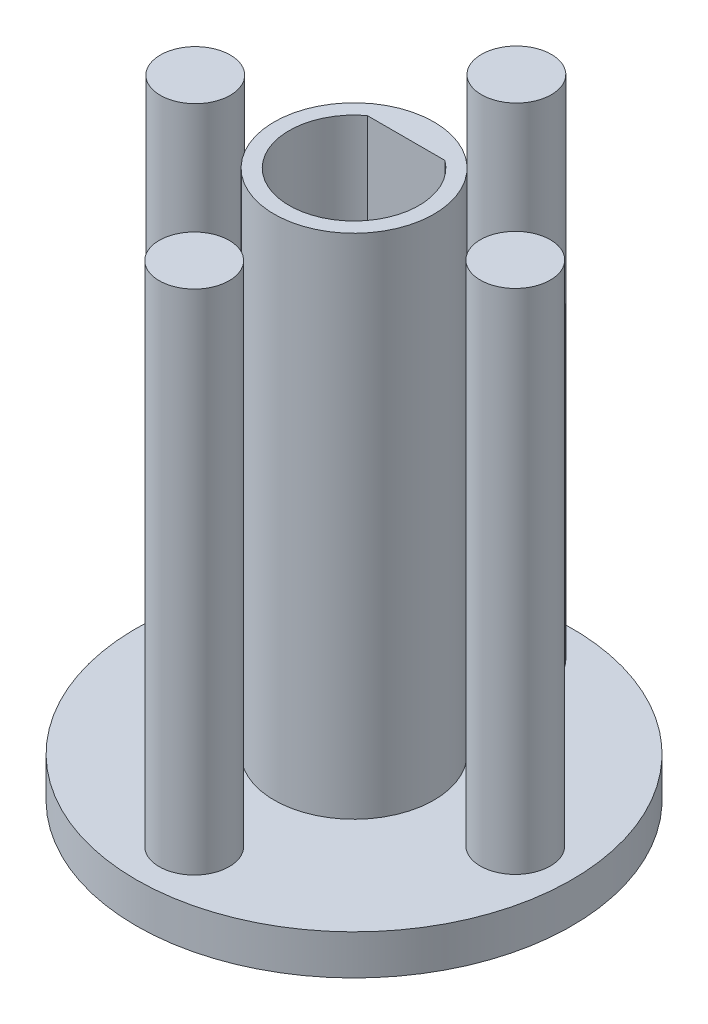
ISO-10303-21;
HEADER;
FILE_DESCRIPTION(('STEP AP214'),'2;1');
FILE_NAME('part.step','',(''),(''),'','','');
FILE_SCHEMA(('AUTOMOTIVE_DESIGN { 1 0 10303 214 1 1 1 1 }'));
ENDSEC;
DATA;
#1=APPLICATION_CONTEXT('core data for automotive mechanical design processes');
#2=APPLICATION_PROTOCOL_DEFINITION('international standard','automotive_design',2000,#1);
#3=PRODUCT_CONTEXT('',#1,'mechanical');
#4=PRODUCT('Part','Part','',(#3));
#5=PRODUCT_RELATED_PRODUCT_CATEGORY('part','',(#4));
#6=PRODUCT_DEFINITION_FORMATION('','',#4);
#7=PRODUCT_DEFINITION_CONTEXT('part definition',#1,'design');
#8=PRODUCT_DEFINITION('design','',#6,#7);
#9=PRODUCT_DEFINITION_SHAPE('','',#8);
#10=(LENGTH_UNIT() NAMED_UNIT(*) SI_UNIT(.MILLI.,.METRE.));
#11=(NAMED_UNIT(*) PLANE_ANGLE_UNIT() SI_UNIT($,.RADIAN.));
#12=(NAMED_UNIT(*) SI_UNIT($,.STERADIAN.) SOLID_ANGLE_UNIT());
#13=UNCERTAINTY_MEASURE_WITH_UNIT(LENGTH_MEASURE(1.E-05),#10,'distance_accuracy_value','');
#14=(GEOMETRIC_REPRESENTATION_CONTEXT(3) GLOBAL_UNCERTAINTY_ASSIGNED_CONTEXT((#13)) GLOBAL_UNIT_ASSIGNED_CONTEXT((#10,
#11,#12)) REPRESENTATION_CONTEXT('',''));
#15=CARTESIAN_POINT('',(0.,0.,0.));
#16=DIRECTION('',(0.,0.,1.));
#17=DIRECTION('',(1.,0.,0.));
#18=AXIS2_PLACEMENT_3D('',#15,#16,#17);
#19=CARTESIAN_POINT('',(0.,2.,0.));
#20=DIRECTION('',(0.,1.,0.));
#21=DIRECTION('',(0.,0.,1.));
#22=AXIS2_PLACEMENT_3D('',#19,#20,#21);
#23=PLANE('',#22);
#24=CARTESIAN_POINT('',(0.,2.,0.));
#25=DIRECTION('',(0.,1.,0.));
#26=DIRECTION('',(0.,0.,1.));
#27=AXIS2_PLACEMENT_3D('',#24,#25,#26);
#28=CIRCLE('',#27,10.9);
#29=CARTESIAN_POINT('',(0.,2.,10.9));
#30=VERTEX_POINT('',#29);
#31=EDGE_CURVE('E110',#30,#30,#28,.T.);
#32=ORIENTED_EDGE('',*,*,#31,.T.);
#33=EDGE_LOOP('',(#32));
#34=FACE_BOUND('',#33,.T.);
#35=CARTESIAN_POINT('',(0.0091799489627781,2.,8.00905715153994));
#36=DIRECTION('',(0.,1.,0.));
#37=DIRECTION('',(0.,0.,1.));
#38=AXIS2_PLACEMENT_3D('',#35,#36,#37);
#39=CIRCLE('',#38,1.75);
#40=CARTESIAN_POINT('',(0.0091799489627781,1.99999999999999,6.25905715153994));
#41=VERTEX_POINT('',#40);
#42=EDGE_CURVE('E46',#41,#41,#39,.T.);
#43=ORIENTED_EDGE('',*,*,#42,.F.);
#44=EDGE_LOOP('',(#43));
#45=FACE_BOUND('',#44,.T.);
#46=CARTESIAN_POINT('',(-7.99946540436632,2.,-0.0531912101153402));
#47=DIRECTION('',(0.,1.,0.));
#48=DIRECTION('',(0.,0.,1.));
#49=AXIS2_PLACEMENT_3D('',#46,#47,#48);
#50=CIRCLE('',#49,1.75);
#51=CARTESIAN_POINT('',(-7.99946540436632,1.99999999999999,-1.80319121011534));
#52=VERTEX_POINT('',#51);
#53=EDGE_CURVE('E106',#52,#52,#50,.F.);
#54=ORIENTED_EDGE('',*,*,#53,.T.);
#55=EDGE_LOOP('',(#54));
#56=FACE_BOUND('',#55,.T.);
#57=CARTESIAN_POINT('',(0.00903447400855788,2.,-8.11558407690636));
#58=DIRECTION('',(0.,1.,0.));
#59=DIRECTION('',(0.,0.,1.));
#60=AXIS2_PLACEMENT_3D('',#57,#58,#59);
#61=CIRCLE('',#60,1.75000000000001);
#62=CARTESIAN_POINT('',(0.00903447400855788,1.99999999999999,-9.86558407690636));
#63=VERTEX_POINT('',#62);
#64=EDGE_CURVE('E100',#63,#63,#61,.F.);
#65=ORIENTED_EDGE('',*,*,#64,.T.);
#66=EDGE_LOOP('',(#65));
#67=FACE_BOUND('',#66,.T.);
#68=CARTESIAN_POINT('',(8.01767982733765,2.,-0.0533357152510716));
#69=DIRECTION('',(0.,1.,0.));
#70=DIRECTION('',(0.,0.,1.));
#71=AXIS2_PLACEMENT_3D('',#68,#69,#70);
#72=CIRCLE('',#71,1.75);
#73=CARTESIAN_POINT('',(8.01767982733765,1.99999999999999,-1.80333571525107));
#74=VERTEX_POINT('',#73);
#75=EDGE_CURVE('E94',#74,#74,#72,.F.);
#76=ORIENTED_EDGE('',*,*,#75,.T.);
#77=EDGE_LOOP('',(#76));
#78=FACE_BOUND('',#77,.T.);
#79=CARTESIAN_POINT('',(0.,2.,0.));
#80=DIRECTION('',(0.,1.,0.));
#81=DIRECTION('',(0.,0.,1.));
#82=AXIS2_PLACEMENT_3D('',#79,#80,#81);
#83=CIRCLE('',#82,4.);
#84=CARTESIAN_POINT('',(0.,1.99999999999999,-4.));
#85=VERTEX_POINT('',#84);
#86=EDGE_CURVE('E88',#85,#85,#83,.F.);
#87=ORIENTED_EDGE('',*,*,#86,.T.);
#88=EDGE_LOOP('',(#87));
#89=FACE_BOUND('',#88,.T.);
#90=ADVANCED_FACE('F42',(#34,#45,#56,#67,#78,#89),#23,.T.);
#91=CARTESIAN_POINT('',(0.0091799489627781,27.4,8.00905715153994));
#92=DIRECTION('',(0.,-1.,0.));
#93=DIRECTION('',(0.,0.,-1.));
#94=AXIS2_PLACEMENT_3D('',#91,#92,#93);
#95=CYLINDRICAL_SURFACE('',#94,1.75);
#96=CARTESIAN_POINT('',(0.0091799489627781,27.4,8.00905715153994));
#97=DIRECTION('',(0.,1.,0.));
#98=DIRECTION('',(0.,0.,1.));
#99=AXIS2_PLACEMENT_3D('',#96,#97,#98);
#100=CIRCLE('',#99,1.75);
#101=CARTESIAN_POINT('',(0.0091799489627781,27.4,6.25905715153994));
#102=VERTEX_POINT('',#101);
#103=EDGE_CURVE('E12',#102,#102,#100,.T.);
#104=CARTESIAN_POINT('',(0.0091799489627781,1.99999999999999,6.25905715153994));
#105=CARTESIAN_POINT('',(0.0091799489627781,2.26458333333333,6.25905715153994));
#106=CARTESIAN_POINT('',(0.0091799489627781,2.52916666666666,6.25905715153994));
#107=CARTESIAN_POINT('',(0.0091799489627781,3.05833333333333,6.25905715153994));
#108=CARTESIAN_POINT('',(0.0091799489627781,3.32291666666666,6.25905715153994));
#109=CARTESIAN_POINT('',(0.0091799489627781,3.85208333333333,6.25905715153994));
#110=CARTESIAN_POINT('',(0.0091799489627781,4.11666666666666,6.25905715153994));
#111=CARTESIAN_POINT('',(0.0091799489627781,4.64583333333333,6.25905715153994));
#112=CARTESIAN_POINT('',(0.0091799489627781,4.91041666666666,6.25905715153994));
#113=CARTESIAN_POINT('',(0.0091799489627781,5.43958333333333,6.25905715153994));
#114=CARTESIAN_POINT('',(0.0091799489627781,5.70416666666666,6.25905715153994));
#115=CARTESIAN_POINT('',(0.0091799489627781,6.23333333333333,6.25905715153994));
#116=CARTESIAN_POINT('',(0.0091799489627781,6.49791666666666,6.25905715153994));
#117=CARTESIAN_POINT('',(0.0091799489627781,7.02708333333333,6.25905715153994));
#118=CARTESIAN_POINT('',(0.0091799489627781,7.29166666666666,6.25905715153994));
#119=CARTESIAN_POINT('',(0.0091799489627781,7.82083333333333,6.25905715153994));
#120=CARTESIAN_POINT('',(0.0091799489627781,8.08541666666666,6.25905715153994));
#121=CARTESIAN_POINT('',(0.0091799489627781,8.61458333333333,6.25905715153994));
#122=CARTESIAN_POINT('',(0.0091799489627781,8.87916666666666,6.25905715153994));
#123=CARTESIAN_POINT('',(0.0091799489627781,9.40833333333333,6.25905715153994));
#124=CARTESIAN_POINT('',(0.0091799489627781,9.67291666666666,6.25905715153994));
#125=CARTESIAN_POINT('',(0.0091799489627781,10.2020833333333,6.25905715153994));
#126=CARTESIAN_POINT('',(0.0091799489627781,10.4666666666667,6.25905715153994));
#127=CARTESIAN_POINT('',(0.0091799489627781,10.9958333333333,6.25905715153994));
#128=CARTESIAN_POINT('',(0.0091799489627781,11.2604166666667,6.25905715153994));
#129=CARTESIAN_POINT('',(0.0091799489627781,11.7895833333333,6.25905715153994));
#130=CARTESIAN_POINT('',(0.0091799489627781,12.0541666666667,6.25905715153994));
#131=CARTESIAN_POINT('',(0.0091799489627781,12.5833333333333,6.25905715153994));
#132=CARTESIAN_POINT('',(0.0091799489627781,12.8479166666667,6.25905715153994));
#133=CARTESIAN_POINT('',(0.0091799489627781,13.3770833333333,6.25905715153994));
#134=CARTESIAN_POINT('',(0.0091799489627781,13.6416666666667,6.25905715153994));
#135=CARTESIAN_POINT('',(0.0091799489627781,14.1708333333333,6.25905715153994));
#136=CARTESIAN_POINT('',(0.0091799489627781,14.4354166666667,6.25905715153994));
#137=CARTESIAN_POINT('',(0.0091799489627781,14.9645833333333,6.25905715153994));
#138=CARTESIAN_POINT('',(0.0091799489627781,15.2291666666667,6.25905715153994));
#139=CARTESIAN_POINT('',(0.0091799489627781,15.7583333333333,6.25905715153994));
#140=CARTESIAN_POINT('',(0.0091799489627781,16.0229166666667,6.25905715153994));
#141=CARTESIAN_POINT('',(0.0091799489627781,16.5520833333333,6.25905715153994));
#142=CARTESIAN_POINT('',(0.0091799489627781,16.8166666666667,6.25905715153994));
#143=CARTESIAN_POINT('',(0.0091799489627781,17.3458333333333,6.25905715153994));
#144=CARTESIAN_POINT('',(0.0091799489627781,17.6104166666667,6.25905715153994));
#145=CARTESIAN_POINT('',(0.0091799489627781,18.1395833333333,6.25905715153994));
#146=CARTESIAN_POINT('',(0.0091799489627781,18.4041666666667,6.25905715153994));
#147=CARTESIAN_POINT('',(0.0091799489627781,18.9333333333333,6.25905715153994));
#148=CARTESIAN_POINT('',(0.0091799489627781,19.1979166666667,6.25905715153994));
#149=CARTESIAN_POINT('',(0.0091799489627781,19.7270833333333,6.25905715153994));
#150=CARTESIAN_POINT('',(0.0091799489627781,19.9916666666667,6.25905715153994));
#151=CARTESIAN_POINT('',(0.0091799489627781,20.5208333333333,6.25905715153994));
#152=CARTESIAN_POINT('',(0.0091799489627781,20.7854166666667,6.25905715153994));
#153=CARTESIAN_POINT('',(0.0091799489627781,21.3145833333333,6.25905715153994));
#154=CARTESIAN_POINT('',(0.0091799489627781,21.5791666666667,6.25905715153994));
#155=CARTESIAN_POINT('',(0.0091799489627781,22.1083333333333,6.25905715153994));
#156=CARTESIAN_POINT('',(0.0091799489627781,22.3729166666667,6.25905715153994));
#157=CARTESIAN_POINT('',(0.0091799489627781,22.9020833333333,6.25905715153994));
#158=CARTESIAN_POINT('',(0.0091799489627781,23.1666666666667,6.25905715153994));
#159=CARTESIAN_POINT('',(0.0091799489627781,23.6958333333333,6.25905715153994));
#160=CARTESIAN_POINT('',(0.0091799489627781,23.9604166666667,6.25905715153994));
#161=CARTESIAN_POINT('',(0.0091799489627781,24.4895833333333,6.25905715153994));
#162=CARTESIAN_POINT('',(0.0091799489627781,24.7541666666667,6.25905715153994));
#163=CARTESIAN_POINT('',(0.0091799489627781,25.2833333333333,6.25905715153994));
#164=CARTESIAN_POINT('',(0.0091799489627781,25.5479166666667,6.25905715153994));
#165=CARTESIAN_POINT('',(0.0091799489627781,26.0770833333333,6.25905715153994));
#166=CARTESIAN_POINT('',(0.0091799489627781,26.3416666666667,6.25905715153994));
#167=CARTESIAN_POINT('',(0.0091799489627781,26.8708333333333,6.25905715153994));
#168=CARTESIAN_POINT('',(0.0091799489627781,27.1354166666667,6.25905715153994));
#169=CARTESIAN_POINT('',(0.0091799489627781,27.4,6.25905715153994));
#170=B_SPLINE_CURVE_WITH_KNOTS('',3,(#104,#105,#106,#107,#108,#109,#110,#111,#112,#113,#114,
#115,#116,#117,#118,#119,#120,#121,#122,#123,#124,#125,#126,#127,#128,#129,#130,#131,#132,#133,
#134,#135,#136,#137,#138,#139,#140,#141,#142,#143,#144,#145,#146,#147,#148,#149,#150,#151,#152,
#153,#154,#155,#156,#157,#158,#159,#160,#161,#162,#163,#164,#165,#166,#167,#168,#169),
.UNSPECIFIED.,.F.,.F.,(4,2,2,2,2,2,2,2,2,2,2,2,2,2,2,2,2,2,2,2,2,2,2,2,2,2,2,2,2,2,2,2,4),(0.,
0.793749999999999,1.5875,2.38125,3.175,3.96875,4.7625,5.55625,6.35,7.14375,7.9375,8.73125,9.525,
10.31875,11.1125,11.90625,12.7,13.49375,14.2875,15.08125,15.875,16.66875,17.4625,18.25625,19.05,
19.84375,20.6375,21.43125,22.225,23.01875,23.8125,24.60625,25.4),.UNSPECIFIED.);
#171=EDGE_CURVE('BSEAM44',#41,#102,#170,.T.);
#172=ORIENTED_EDGE('',*,*,#42,.T.);
#173=ORIENTED_EDGE('',*,*,#103,.F.);
#174=ORIENTED_EDGE('',*,*,#171,.T.);
#175=ORIENTED_EDGE('',*,*,#171,.F.);
#176=EDGE_LOOP('',(#172,#174,#173,#175));
#177=FACE_BOUND('',#176,.T.);
#178=ADVANCED_FACE('F44',(#177),#95,.T.);
#179=CARTESIAN_POINT('',(0.0091799489627781,27.4,8.00905715153994));
#180=DIRECTION('',(0.,1.,0.));
#181=DIRECTION('',(0.,0.,1.));
#182=AXIS2_PLACEMENT_3D('',#179,#180,#181);
#183=PLANE('',#182);
#184=ORIENTED_EDGE('',*,*,#103,.T.);
#185=EDGE_LOOP('',(#184));
#186=FACE_BOUND('',#185,.T.);
#187=ADVANCED_FACE('F128',(#186),#183,.T.);
#188=CARTESIAN_POINT('',(0.,2.,0.));
#189=DIRECTION('',(0.,-1.,0.));
#190=DIRECTION('',(0.,0.,-1.));
#191=AXIS2_PLACEMENT_3D('',#188,#189,#190);
#192=CYLINDRICAL_SURFACE('',#191,10.9);
#193=ORIENTED_EDGE('',*,*,#31,.F.);
#194=EDGE_LOOP('',(#193));
#195=FACE_BOUND('',#194,.T.);
#196=CARTESIAN_POINT('',(0.,0.,0.));
#197=DIRECTION('',(0.,1.,0.));
#198=DIRECTION('',(0.,0.,1.));
#199=AXIS2_PLACEMENT_3D('',#196,#197,#198);
#200=CIRCLE('',#199,10.9);
#201=CARTESIAN_POINT('',(0.,0.,10.9));
#202=VERTEX_POINT('',#201);
#203=EDGE_CURVE('E109',#202,#202,#200,.T.);
#204=ORIENTED_EDGE('',*,*,#203,.T.);
#205=EDGE_LOOP('',(#204));
#206=FACE_BOUND('',#205,.T.);
#207=ADVANCED_FACE('F116',(#195,#206),#192,.T.);
#208=CARTESIAN_POINT('',(0.0091799489627781,0.,8.00905715153994));
#209=DIRECTION('',(0.,1.,0.));
#210=DIRECTION('',(0.,0.,1.));
#211=AXIS2_PLACEMENT_3D('',#208,#209,#210);
#212=PLANE('',#211);
#213=ORIENTED_EDGE('',*,*,#203,.F.);
#214=EDGE_LOOP('',(#213));
#215=FACE_BOUND('',#214,.T.);
#216=ADVANCED_FACE('F118',(#215),#212,.F.);
#217=CARTESIAN_POINT('',(-7.99946540436632,27.4,-0.0531912101153402));
#218=DIRECTION('',(0.,-1.,0.));
#219=DIRECTION('',(0.,0.,-1.));
#220=AXIS2_PLACEMENT_3D('',#217,#218,#219);
#221=CYLINDRICAL_SURFACE('',#220,1.75);
#222=CARTESIAN_POINT('',(-7.99946540436632,27.4,-0.0531912101153402));
#223=DIRECTION('',(0.,1.,0.));
#224=DIRECTION('',(0.,0.,1.));
#225=AXIS2_PLACEMENT_3D('',#222,#223,#224);
#226=CIRCLE('',#225,1.75);
#227=CARTESIAN_POINT('',(-7.99946540436632,27.4,-1.80319121011534));
#228=VERTEX_POINT('',#227);
#229=EDGE_CURVE('E103',#228,#228,#226,.T.);
#230=CARTESIAN_POINT('',(-7.99946540436632,1.99999999999999,-1.80319121011534));
#231=CARTESIAN_POINT('',(-7.99946540436632,2.26458333333333,-1.80319121011534));
#232=CARTESIAN_POINT('',(-7.99946540436632,2.52916666666666,-1.80319121011534));
#233=CARTESIAN_POINT('',(-7.99946540436632,3.05833333333333,-1.80319121011534));
#234=CARTESIAN_POINT('',(-7.99946540436632,3.32291666666666,-1.80319121011534));
#235=CARTESIAN_POINT('',(-7.99946540436632,3.85208333333333,-1.80319121011534));
#236=CARTESIAN_POINT('',(-7.99946540436632,4.11666666666666,-1.80319121011534));
#237=CARTESIAN_POINT('',(-7.99946540436632,4.64583333333333,-1.80319121011534));
#238=CARTESIAN_POINT('',(-7.99946540436632,4.91041666666666,-1.80319121011534));
#239=CARTESIAN_POINT('',(-7.99946540436632,5.43958333333333,-1.80319121011534));
#240=CARTESIAN_POINT('',(-7.99946540436632,5.70416666666666,-1.80319121011534));
#241=CARTESIAN_POINT('',(-7.99946540436632,6.23333333333333,-1.80319121011534));
#242=CARTESIAN_POINT('',(-7.99946540436632,6.49791666666666,-1.80319121011534));
#243=CARTESIAN_POINT('',(-7.99946540436632,7.02708333333333,-1.80319121011534));
#244=CARTESIAN_POINT('',(-7.99946540436632,7.29166666666666,-1.80319121011534));
#245=CARTESIAN_POINT('',(-7.99946540436632,7.82083333333333,-1.80319121011534));
#246=CARTESIAN_POINT('',(-7.99946540436632,8.08541666666666,-1.80319121011534));
#247=CARTESIAN_POINT('',(-7.99946540436632,8.61458333333333,-1.80319121011534));
#248=CARTESIAN_POINT('',(-7.99946540436632,8.87916666666666,-1.80319121011534));
#249=CARTESIAN_POINT('',(-7.99946540436632,9.40833333333333,-1.80319121011534));
#250=CARTESIAN_POINT('',(-7.99946540436632,9.67291666666666,-1.80319121011534));
#251=CARTESIAN_POINT('',(-7.99946540436632,10.2020833333333,-1.80319121011534));
#252=CARTESIAN_POINT('',(-7.99946540436632,10.4666666666667,-1.80319121011534));
#253=CARTESIAN_POINT('',(-7.99946540436632,10.9958333333333,-1.80319121011534));
#254=CARTESIAN_POINT('',(-7.99946540436632,11.2604166666667,-1.80319121011534));
#255=CARTESIAN_POINT('',(-7.99946540436632,11.7895833333333,-1.80319121011534));
#256=CARTESIAN_POINT('',(-7.99946540436632,12.0541666666667,-1.80319121011534));
#257=CARTESIAN_POINT('',(-7.99946540436632,12.5833333333333,-1.80319121011534));
#258=CARTESIAN_POINT('',(-7.99946540436632,12.8479166666667,-1.80319121011534));
#259=CARTESIAN_POINT('',(-7.99946540436632,13.3770833333333,-1.80319121011534));
#260=CARTESIAN_POINT('',(-7.99946540436632,13.6416666666667,-1.80319121011534));
#261=CARTESIAN_POINT('',(-7.99946540436632,14.1708333333333,-1.80319121011534));
#262=CARTESIAN_POINT('',(-7.99946540436632,14.4354166666667,-1.80319121011534));
#263=CARTESIAN_POINT('',(-7.99946540436632,14.9645833333333,-1.80319121011534));
#264=CARTESIAN_POINT('',(-7.99946540436632,15.2291666666667,-1.80319121011534));
#265=CARTESIAN_POINT('',(-7.99946540436632,15.7583333333333,-1.80319121011534));
#266=CARTESIAN_POINT('',(-7.99946540436632,16.0229166666667,-1.80319121011534));
#267=CARTESIAN_POINT('',(-7.99946540436632,16.5520833333333,-1.80319121011534));
#268=CARTESIAN_POINT('',(-7.99946540436632,16.8166666666667,-1.80319121011534));
#269=CARTESIAN_POINT('',(-7.99946540436632,17.3458333333333,-1.80319121011534));
#270=CARTESIAN_POINT('',(-7.99946540436632,17.6104166666667,-1.80319121011534));
#271=CARTESIAN_POINT('',(-7.99946540436632,18.1395833333333,-1.80319121011534));
#272=CARTESIAN_POINT('',(-7.99946540436632,18.4041666666667,-1.80319121011534));
#273=CARTESIAN_POINT('',(-7.99946540436632,18.9333333333333,-1.80319121011534));
#274=CARTESIAN_POINT('',(-7.99946540436632,19.1979166666667,-1.80319121011534));
#275=CARTESIAN_POINT('',(-7.99946540436632,19.7270833333333,-1.80319121011534));
#276=CARTESIAN_POINT('',(-7.99946540436632,19.9916666666667,-1.80319121011534));
#277=CARTESIAN_POINT('',(-7.99946540436632,20.5208333333333,-1.80319121011534));
#278=CARTESIAN_POINT('',(-7.99946540436632,20.7854166666667,-1.80319121011534));
#279=CARTESIAN_POINT('',(-7.99946540436632,21.3145833333333,-1.80319121011534));
#280=CARTESIAN_POINT('',(-7.99946540436632,21.5791666666667,-1.80319121011534));
#281=CARTESIAN_POINT('',(-7.99946540436632,22.1083333333333,-1.80319121011534));
#282=CARTESIAN_POINT('',(-7.99946540436632,22.3729166666667,-1.80319121011534));
#283=CARTESIAN_POINT('',(-7.99946540436632,22.9020833333333,-1.80319121011534));
#284=CARTESIAN_POINT('',(-7.99946540436632,23.1666666666667,-1.80319121011534));
#285=CARTESIAN_POINT('',(-7.99946540436632,23.6958333333333,-1.80319121011534));
#286=CARTESIAN_POINT('',(-7.99946540436632,23.9604166666667,-1.80319121011534));
#287=CARTESIAN_POINT('',(-7.99946540436632,24.4895833333333,-1.80319121011534));
#288=CARTESIAN_POINT('',(-7.99946540436632,24.7541666666667,-1.80319121011534));
#289=CARTESIAN_POINT('',(-7.99946540436632,25.2833333333333,-1.80319121011534));
#290=CARTESIAN_POINT('',(-7.99946540436632,25.5479166666667,-1.80319121011534));
#291=CARTESIAN_POINT('',(-7.99946540436632,26.0770833333333,-1.80319121011534));
#292=CARTESIAN_POINT('',(-7.99946540436632,26.3416666666667,-1.80319121011534));
#293=CARTESIAN_POINT('',(-7.99946540436632,26.8708333333333,-1.80319121011534));
#294=CARTESIAN_POINT('',(-7.99946540436632,27.1354166666667,-1.80319121011534));
#295=CARTESIAN_POINT('',(-7.99946540436632,27.4,-1.80319121011534));
#296=B_SPLINE_CURVE_WITH_KNOTS('',3,(#230,#231,#232,#233,#234,#235,#236,#237,#238,#239,#240,
#241,#242,#243,#244,#245,#246,#247,#248,#249,#250,#251,#252,#253,#254,#255,#256,#257,#258,#259,
#260,#261,#262,#263,#264,#265,#266,#267,#268,#269,#270,#271,#272,#273,#274,#275,#276,#277,#278,
#279,#280,#281,#282,#283,#284,#285,#286,#287,#288,#289,#290,#291,#292,#293,#294,#295),
.UNSPECIFIED.,.F.,.F.,(4,2,2,2,2,2,2,2,2,2,2,2,2,2,2,2,2,2,2,2,2,2,2,2,2,2,2,2,2,2,2,2,4),(0.,
0.793749999999999,1.5875,2.38125,3.175,3.96875,4.7625,5.55625,6.35,7.14375,7.9375,8.73125,9.525,
10.31875,11.1125,11.90625,12.7,13.49375,14.2875,15.08125,15.875,16.66875,17.4625,18.25625,19.05,
19.84375,20.6375,21.43125,22.225,23.01875,23.8125,24.60625,25.4),.UNSPECIFIED.);
#297=EDGE_CURVE('BSEAM120',#52,#228,#296,.T.);
#298=ORIENTED_EDGE('',*,*,#53,.F.);
#299=ORIENTED_EDGE('',*,*,#229,.F.);
#300=ORIENTED_EDGE('',*,*,#297,.T.);
#301=ORIENTED_EDGE('',*,*,#297,.F.);
#302=EDGE_LOOP('',(#298,#300,#299,#301));
#303=FACE_BOUND('',#302,.T.);
#304=ADVANCED_FACE('F120',(#303),#221,.T.);
#305=CARTESIAN_POINT('',(-7.99946540436632,27.4,-0.0531912101153402));
#306=DIRECTION('',(0.,1.,0.));
#307=DIRECTION('',(0.,0.,1.));
#308=AXIS2_PLACEMENT_3D('',#305,#306,#307);
#309=PLANE('',#308);
#310=ORIENTED_EDGE('',*,*,#229,.T.);
#311=EDGE_LOOP('',(#310));
#312=FACE_BOUND('',#311,.T.);
#313=ADVANCED_FACE('F125',(#312),#309,.T.);
#314=CARTESIAN_POINT('',(0.00903447400855788,27.4,-8.11558407690636));
#315=DIRECTION('',(0.,-1.,0.));
#316=DIRECTION('',(0.,0.,-1.));
#317=AXIS2_PLACEMENT_3D('',#314,#315,#316);
#318=CYLINDRICAL_SURFACE('',#317,1.75000000000001);
#319=CARTESIAN_POINT('',(0.00903447400855788,27.4,-8.11558407690636));
#320=DIRECTION('',(0.,1.,0.));
#321=DIRECTION('',(0.,0.,1.));
#322=AXIS2_PLACEMENT_3D('',#319,#320,#321);
#323=CIRCLE('',#322,1.75000000000001);
#324=CARTESIAN_POINT('',(0.00903447400855788,27.4,-9.86558407690636));
#325=VERTEX_POINT('',#324);
#326=EDGE_CURVE('E97',#325,#325,#323,.T.);
#327=CARTESIAN_POINT('',(0.00903447400855788,1.99999999999999,-9.86558407690636));
#328=CARTESIAN_POINT('',(0.00903447400855788,2.26458333333333,-9.86558407690636));
#329=CARTESIAN_POINT('',(0.00903447400855788,2.52916666666666,-9.86558407690636));
#330=CARTESIAN_POINT('',(0.00903447400855788,3.05833333333333,-9.86558407690636));
#331=CARTESIAN_POINT('',(0.00903447400855788,3.32291666666666,-9.86558407690636));
#332=CARTESIAN_POINT('',(0.00903447400855788,3.85208333333333,-9.86558407690636));
#333=CARTESIAN_POINT('',(0.00903447400855788,4.11666666666666,-9.86558407690636));
#334=CARTESIAN_POINT('',(0.00903447400855788,4.64583333333333,-9.86558407690636));
#335=CARTESIAN_POINT('',(0.00903447400855788,4.91041666666666,-9.86558407690636));
#336=CARTESIAN_POINT('',(0.00903447400855788,5.43958333333333,-9.86558407690636));
#337=CARTESIAN_POINT('',(0.00903447400855788,5.70416666666666,-9.86558407690636));
#338=CARTESIAN_POINT('',(0.00903447400855788,6.23333333333333,-9.86558407690636));
#339=CARTESIAN_POINT('',(0.00903447400855788,6.49791666666666,-9.86558407690636));
#340=CARTESIAN_POINT('',(0.00903447400855788,7.02708333333333,-9.86558407690636));
#341=CARTESIAN_POINT('',(0.00903447400855788,7.29166666666666,-9.86558407690636));
#342=CARTESIAN_POINT('',(0.00903447400855788,7.82083333333333,-9.86558407690636));
#343=CARTESIAN_POINT('',(0.00903447400855788,8.08541666666666,-9.86558407690636));
#344=CARTESIAN_POINT('',(0.00903447400855788,8.61458333333333,-9.86558407690636));
#345=CARTESIAN_POINT('',(0.00903447400855788,8.87916666666666,-9.86558407690636));
#346=CARTESIAN_POINT('',(0.00903447400855788,9.40833333333333,-9.86558407690636));
#347=CARTESIAN_POINT('',(0.00903447400855788,9.67291666666666,-9.86558407690636));
#348=CARTESIAN_POINT('',(0.00903447400855788,10.2020833333333,-9.86558407690636));
#349=CARTESIAN_POINT('',(0.00903447400855788,10.4666666666667,-9.86558407690636));
#350=CARTESIAN_POINT('',(0.00903447400855788,10.9958333333333,-9.86558407690636));
#351=CARTESIAN_POINT('',(0.00903447400855788,11.2604166666667,-9.86558407690636));
#352=CARTESIAN_POINT('',(0.00903447400855788,11.7895833333333,-9.86558407690636));
#353=CARTESIAN_POINT('',(0.00903447400855788,12.0541666666667,-9.86558407690636));
#354=CARTESIAN_POINT('',(0.00903447400855788,12.5833333333333,-9.86558407690636));
#355=CARTESIAN_POINT('',(0.00903447400855788,12.8479166666667,-9.86558407690636));
#356=CARTESIAN_POINT('',(0.00903447400855788,13.3770833333333,-9.86558407690636));
#357=CARTESIAN_POINT('',(0.00903447400855788,13.6416666666667,-9.86558407690636));
#358=CARTESIAN_POINT('',(0.00903447400855788,14.1708333333333,-9.86558407690636));
#359=CARTESIAN_POINT('',(0.00903447400855788,14.4354166666667,-9.86558407690636));
#360=CARTESIAN_POINT('',(0.00903447400855788,14.9645833333333,-9.86558407690636));
#361=CARTESIAN_POINT('',(0.00903447400855788,15.2291666666667,-9.86558407690636));
#362=CARTESIAN_POINT('',(0.00903447400855788,15.7583333333333,-9.86558407690636));
#363=CARTESIAN_POINT('',(0.00903447400855788,16.0229166666667,-9.86558407690636));
#364=CARTESIAN_POINT('',(0.00903447400855788,16.5520833333333,-9.86558407690636));
#365=CARTESIAN_POINT('',(0.00903447400855788,16.8166666666667,-9.86558407690636));
#366=CARTESIAN_POINT('',(0.00903447400855788,17.3458333333333,-9.86558407690636));
#367=CARTESIAN_POINT('',(0.00903447400855788,17.6104166666667,-9.86558407690636));
#368=CARTESIAN_POINT('',(0.00903447400855788,18.1395833333333,-9.86558407690636));
#369=CARTESIAN_POINT('',(0.00903447400855788,18.4041666666667,-9.86558407690636));
#370=CARTESIAN_POINT('',(0.00903447400855788,18.9333333333333,-9.86558407690636));
#371=CARTESIAN_POINT('',(0.00903447400855788,19.1979166666667,-9.86558407690636));
#372=CARTESIAN_POINT('',(0.00903447400855788,19.7270833333333,-9.86558407690636));
#373=CARTESIAN_POINT('',(0.00903447400855788,19.9916666666667,-9.86558407690636));
#374=CARTESIAN_POINT('',(0.00903447400855788,20.5208333333333,-9.86558407690636));
#375=CARTESIAN_POINT('',(0.00903447400855788,20.7854166666667,-9.86558407690636));
#376=CARTESIAN_POINT('',(0.00903447400855788,21.3145833333333,-9.86558407690636));
#377=CARTESIAN_POINT('',(0.00903447400855788,21.5791666666667,-9.86558407690636));
#378=CARTESIAN_POINT('',(0.00903447400855788,22.1083333333333,-9.86558407690636));
#379=CARTESIAN_POINT('',(0.00903447400855788,22.3729166666667,-9.86558407690636));
#380=CARTESIAN_POINT('',(0.00903447400855788,22.9020833333333,-9.86558407690636));
#381=CARTESIAN_POINT('',(0.00903447400855788,23.1666666666667,-9.86558407690636));
#382=CARTESIAN_POINT('',(0.00903447400855788,23.6958333333333,-9.86558407690636));
#383=CARTESIAN_POINT('',(0.00903447400855788,23.9604166666667,-9.86558407690636));
#384=CARTESIAN_POINT('',(0.00903447400855788,24.4895833333333,-9.86558407690636));
#385=CARTESIAN_POINT('',(0.00903447400855788,24.7541666666667,-9.86558407690636));
#386=CARTESIAN_POINT('',(0.00903447400855788,25.2833333333333,-9.86558407690636));
#387=CARTESIAN_POINT('',(0.00903447400855788,25.5479166666667,-9.86558407690636));
#388=CARTESIAN_POINT('',(0.00903447400855788,26.0770833333333,-9.86558407690636));
#389=CARTESIAN_POINT('',(0.00903447400855788,26.3416666666667,-9.86558407690636));
#390=CARTESIAN_POINT('',(0.00903447400855788,26.8708333333333,-9.86558407690636));
#391=CARTESIAN_POINT('',(0.00903447400855788,27.1354166666667,-9.86558407690636));
#392=CARTESIAN_POINT('',(0.00903447400855788,27.4,-9.86558407690636));
#393=B_SPLINE_CURVE_WITH_KNOTS('',3,(#327,#328,#329,#330,#331,#332,#333,#334,#335,#336,#337,
#338,#339,#340,#341,#342,#343,#344,#345,#346,#347,#348,#349,#350,#351,#352,#353,#354,#355,#356,
#357,#358,#359,#360,#361,#362,#363,#364,#365,#366,#367,#368,#369,#370,#371,#372,#373,#374,#375,
#376,#377,#378,#379,#380,#381,#382,#383,#384,#385,#386,#387,#388,#389,#390,#391,#392),
.UNSPECIFIED.,.F.,.F.,(4,2,2,2,2,2,2,2,2,2,2,2,2,2,2,2,2,2,2,2,2,2,2,2,2,2,2,2,2,2,2,2,4),(0.,
0.793749999999999,1.5875,2.38125,3.175,3.96875,4.7625,5.55625,6.35,7.14375,7.9375,8.73125,9.525,
10.31875,11.1125,11.90625,12.7,13.49375,14.2875,15.08125,15.875,16.66875,17.4625,18.25625,19.05,
19.84375,20.6375,21.43125,22.225,23.01875,23.8125,24.60625,25.4),.UNSPECIFIED.);
#394=EDGE_CURVE('BSEAM164',#63,#325,#393,.T.);
#395=ORIENTED_EDGE('',*,*,#64,.F.);
#396=ORIENTED_EDGE('',*,*,#326,.F.);
#397=ORIENTED_EDGE('',*,*,#394,.T.);
#398=ORIENTED_EDGE('',*,*,#394,.F.);
#399=EDGE_LOOP('',(#395,#397,#396,#398));
#400=FACE_BOUND('',#399,.T.);
#401=ADVANCED_FACE('F164',(#400),#318,.T.);
#402=CARTESIAN_POINT('',(0.00903447400855788,27.4,-8.11558407690636));
#403=DIRECTION('',(0.,1.,0.));
#404=DIRECTION('',(0.,0.,1.));
#405=AXIS2_PLACEMENT_3D('',#402,#403,#404);
#406=PLANE('',#405);
#407=ORIENTED_EDGE('',*,*,#326,.T.);
#408=EDGE_LOOP('',(#407));
#409=FACE_BOUND('',#408,.T.);
#410=ADVANCED_FACE('F159',(#409),#406,.T.);
#411=CARTESIAN_POINT('',(8.01767982733765,27.4,-0.0533357152510716));
#412=DIRECTION('',(0.,-1.,0.));
#413=DIRECTION('',(0.,0.,-1.));
#414=AXIS2_PLACEMENT_3D('',#411,#412,#413);
#415=CYLINDRICAL_SURFACE('',#414,1.75);
#416=CARTESIAN_POINT('',(8.01767982733765,27.4,-0.0533357152510716));
#417=DIRECTION('',(0.,1.,0.));
#418=DIRECTION('',(0.,0.,1.));
#419=AXIS2_PLACEMENT_3D('',#416,#417,#418);
#420=CIRCLE('',#419,1.75);
#421=CARTESIAN_POINT('',(8.01767982733765,27.4,-1.80333571525107));
#422=VERTEX_POINT('',#421);
#423=EDGE_CURVE('E91',#422,#422,#420,.T.);
#424=CARTESIAN_POINT('',(8.01767982733765,1.99999999999999,-1.80333571525107));
#425=CARTESIAN_POINT('',(8.01767982733765,2.26458333333333,-1.80333571525107));
#426=CARTESIAN_POINT('',(8.01767982733765,2.52916666666666,-1.80333571525107));
#427=CARTESIAN_POINT('',(8.01767982733765,3.05833333333333,-1.80333571525107));
#428=CARTESIAN_POINT('',(8.01767982733765,3.32291666666666,-1.80333571525107));
#429=CARTESIAN_POINT('',(8.01767982733765,3.85208333333333,-1.80333571525107));
#430=CARTESIAN_POINT('',(8.01767982733765,4.11666666666666,-1.80333571525107));
#431=CARTESIAN_POINT('',(8.01767982733765,4.64583333333333,-1.80333571525107));
#432=CARTESIAN_POINT('',(8.01767982733765,4.91041666666666,-1.80333571525107));
#433=CARTESIAN_POINT('',(8.01767982733765,5.43958333333333,-1.80333571525107));
#434=CARTESIAN_POINT('',(8.01767982733765,5.70416666666666,-1.80333571525107));
#435=CARTESIAN_POINT('',(8.01767982733765,6.23333333333333,-1.80333571525107));
#436=CARTESIAN_POINT('',(8.01767982733765,6.49791666666666,-1.80333571525107));
#437=CARTESIAN_POINT('',(8.01767982733765,7.02708333333333,-1.80333571525107));
#438=CARTESIAN_POINT('',(8.01767982733765,7.29166666666666,-1.80333571525107));
#439=CARTESIAN_POINT('',(8.01767982733765,7.82083333333333,-1.80333571525107));
#440=CARTESIAN_POINT('',(8.01767982733765,8.08541666666666,-1.80333571525107));
#441=CARTESIAN_POINT('',(8.01767982733765,8.61458333333333,-1.80333571525107));
#442=CARTESIAN_POINT('',(8.01767982733765,8.87916666666666,-1.80333571525107));
#443=CARTESIAN_POINT('',(8.01767982733765,9.40833333333333,-1.80333571525107));
#444=CARTESIAN_POINT('',(8.01767982733765,9.67291666666666,-1.80333571525107));
#445=CARTESIAN_POINT('',(8.01767982733765,10.2020833333333,-1.80333571525107));
#446=CARTESIAN_POINT('',(8.01767982733765,10.4666666666667,-1.80333571525107));
#447=CARTESIAN_POINT('',(8.01767982733765,10.9958333333333,-1.80333571525107));
#448=CARTESIAN_POINT('',(8.01767982733765,11.2604166666667,-1.80333571525107));
#449=CARTESIAN_POINT('',(8.01767982733765,11.7895833333333,-1.80333571525107));
#450=CARTESIAN_POINT('',(8.01767982733765,12.0541666666667,-1.80333571525107));
#451=CARTESIAN_POINT('',(8.01767982733765,12.5833333333333,-1.80333571525107));
#452=CARTESIAN_POINT('',(8.01767982733765,12.8479166666667,-1.80333571525107));
#453=CARTESIAN_POINT('',(8.01767982733765,13.3770833333333,-1.80333571525107));
#454=CARTESIAN_POINT('',(8.01767982733765,13.6416666666667,-1.80333571525107));
#455=CARTESIAN_POINT('',(8.01767982733765,14.1708333333333,-1.80333571525107));
#456=CARTESIAN_POINT('',(8.01767982733765,14.4354166666667,-1.80333571525107));
#457=CARTESIAN_POINT('',(8.01767982733765,14.9645833333333,-1.80333571525107));
#458=CARTESIAN_POINT('',(8.01767982733765,15.2291666666667,-1.80333571525107));
#459=CARTESIAN_POINT('',(8.01767982733765,15.7583333333333,-1.80333571525107));
#460=CARTESIAN_POINT('',(8.01767982733765,16.0229166666667,-1.80333571525107));
#461=CARTESIAN_POINT('',(8.01767982733765,16.5520833333333,-1.80333571525107));
#462=CARTESIAN_POINT('',(8.01767982733765,16.8166666666667,-1.80333571525107));
#463=CARTESIAN_POINT('',(8.01767982733765,17.3458333333333,-1.80333571525107));
#464=CARTESIAN_POINT('',(8.01767982733765,17.6104166666667,-1.80333571525107));
#465=CARTESIAN_POINT('',(8.01767982733765,18.1395833333333,-1.80333571525107));
#466=CARTESIAN_POINT('',(8.01767982733765,18.4041666666667,-1.80333571525107));
#467=CARTESIAN_POINT('',(8.01767982733765,18.9333333333333,-1.80333571525107));
#468=CARTESIAN_POINT('',(8.01767982733765,19.1979166666667,-1.80333571525107));
#469=CARTESIAN_POINT('',(8.01767982733765,19.7270833333333,-1.80333571525107));
#470=CARTESIAN_POINT('',(8.01767982733765,19.9916666666667,-1.80333571525107));
#471=CARTESIAN_POINT('',(8.01767982733765,20.5208333333333,-1.80333571525107));
#472=CARTESIAN_POINT('',(8.01767982733765,20.7854166666667,-1.80333571525107));
#473=CARTESIAN_POINT('',(8.01767982733765,21.3145833333333,-1.80333571525107));
#474=CARTESIAN_POINT('',(8.01767982733765,21.5791666666667,-1.80333571525107));
#475=CARTESIAN_POINT('',(8.01767982733765,22.1083333333333,-1.80333571525107));
#476=CARTESIAN_POINT('',(8.01767982733765,22.3729166666667,-1.80333571525107));
#477=CARTESIAN_POINT('',(8.01767982733765,22.9020833333333,-1.80333571525107));
#478=CARTESIAN_POINT('',(8.01767982733765,23.1666666666667,-1.80333571525107));
#479=CARTESIAN_POINT('',(8.01767982733765,23.6958333333333,-1.80333571525107));
#480=CARTESIAN_POINT('',(8.01767982733765,23.9604166666667,-1.80333571525107));
#481=CARTESIAN_POINT('',(8.01767982733765,24.4895833333333,-1.80333571525107));
#482=CARTESIAN_POINT('',(8.01767982733765,24.7541666666667,-1.80333571525107));
#483=CARTESIAN_POINT('',(8.01767982733765,25.2833333333333,-1.80333571525107));
#484=CARTESIAN_POINT('',(8.01767982733765,25.5479166666667,-1.80333571525107));
#485=CARTESIAN_POINT('',(8.01767982733765,26.0770833333333,-1.80333571525107));
#486=CARTESIAN_POINT('',(8.01767982733765,26.3416666666667,-1.80333571525107));
#487=CARTESIAN_POINT('',(8.01767982733765,26.8708333333333,-1.80333571525107));
#488=CARTESIAN_POINT('',(8.01767982733765,27.1354166666667,-1.80333571525107));
#489=CARTESIAN_POINT('',(8.01767982733765,27.4,-1.80333571525107));
#490=B_SPLINE_CURVE_WITH_KNOTS('',3,(#424,#425,#426,#427,#428,#429,#430,#431,#432,#433,#434,
#435,#436,#437,#438,#439,#440,#441,#442,#443,#444,#445,#446,#447,#448,#449,#450,#451,#452,#453,
#454,#455,#456,#457,#458,#459,#460,#461,#462,#463,#464,#465,#466,#467,#468,#469,#470,#471,#472,
#473,#474,#475,#476,#477,#478,#479,#480,#481,#482,#483,#484,#485,#486,#487,#488,#489),
.UNSPECIFIED.,.F.,.F.,(4,2,2,2,2,2,2,2,2,2,2,2,2,2,2,2,2,2,2,2,2,2,2,2,2,2,2,2,2,2,2,2,4),(0.,
0.793749999999999,1.5875,2.38125,3.175,3.96875,4.7625,5.55625,6.35,7.14375,7.9375,8.73125,9.525,
10.31875,11.1125,11.90625,12.7,13.49375,14.2875,15.08125,15.875,16.66875,17.4625,18.25625,19.05,
19.84375,20.6375,21.43125,22.225,23.01875,23.8125,24.60625,25.4),.UNSPECIFIED.);
#491=EDGE_CURVE('BSEAM155',#74,#422,#490,.T.);
#492=ORIENTED_EDGE('',*,*,#75,.F.);
#493=ORIENTED_EDGE('',*,*,#423,.F.);
#494=ORIENTED_EDGE('',*,*,#491,.T.);
#495=ORIENTED_EDGE('',*,*,#491,.F.);
#496=EDGE_LOOP('',(#492,#494,#493,#495));
#497=FACE_BOUND('',#496,.T.);
#498=ADVANCED_FACE('F155',(#497),#415,.T.);
#499=CARTESIAN_POINT('',(8.01767982733765,27.4,-0.0533357152510716));
#500=DIRECTION('',(0.,1.,0.));
#501=DIRECTION('',(0.,0.,1.));
#502=AXIS2_PLACEMENT_3D('',#499,#500,#501);
#503=PLANE('',#502);
#504=ORIENTED_EDGE('',*,*,#423,.T.);
#505=EDGE_LOOP('',(#504));
#506=FACE_BOUND('',#505,.T.);
#507=ADVANCED_FACE('F158',(#506),#503,.T.);
#508=CARTESIAN_POINT('',(0.,27.4,0.));
#509=DIRECTION('',(0.,1.,0.));
#510=DIRECTION('',(0.,0.,1.));
#511=AXIS2_PLACEMENT_3D('',#508,#509,#510);
#512=PLANE('',#511);
#513=CARTESIAN_POINT('',(0.,27.4,0.));
#514=DIRECTION('',(0.,1.,0.));
#515=DIRECTION('',(0.,0.,1.));
#516=AXIS2_PLACEMENT_3D('',#513,#514,#515);
#517=CIRCLE('',#516,4.);
#518=CARTESIAN_POINT('',(0.,27.4,-4.));
#519=VERTEX_POINT('',#518);
#520=EDGE_CURVE('E75',#519,#519,#517,.T.);
#521=ORIENTED_EDGE('',*,*,#520,.T.);
#522=EDGE_LOOP('',(#521));
#523=FACE_BOUND('',#522,.T.);
#524=DIRECTION('',(1.,0.,0.));
#525=VECTOR('',#524,1.);
#526=CARTESIAN_POINT('',(-1.94264577563398,27.4,-2.60549945123991));
#527=LINE('',#526,#525);
#528=CARTESIAN_POINT('',(-1.94264577563398,27.4,-2.60549945123991));
#529=VERTEX_POINT('',#528);
#530=CARTESIAN_POINT('',(1.94264577563398,27.4,-2.60549945123991));
#531=VERTEX_POINT('',#530);
#532=EDGE_CURVE('E71',#529,#531,#527,.T.);
#533=ORIENTED_EDGE('',*,*,#532,.T.);
#534=CARTESIAN_POINT('',(0.,27.4,0.));
#535=DIRECTION('',(0.,1.,0.));
#536=DIRECTION('',(0.,0.,1.));
#537=AXIS2_PLACEMENT_3D('',#534,#535,#536);
#538=CIRCLE('',#537,3.25);
#539=EDGE_CURVE('E77',#529,#531,#538,.T.);
#540=ORIENTED_EDGE('',*,*,#539,.F.);
#541=EDGE_LOOP('',(#533,#540));
#542=FACE_BOUND('',#541,.T.);
#543=ADVANCED_FACE('F81',(#523,#542),#512,.T.);
#544=CARTESIAN_POINT('',(0.,27.4,0.));
#545=DIRECTION('',(0.,-1.,0.));
#546=DIRECTION('',(0.,0.,-1.));
#547=AXIS2_PLACEMENT_3D('',#544,#545,#546);
#548=CYLINDRICAL_SURFACE('',#547,4.);
#549=CARTESIAN_POINT('',(0.,1.99999999999999,-4.));
#550=CARTESIAN_POINT('',(0.,2.26458333333333,-4.));
#551=CARTESIAN_POINT('',(0.,2.52916666666666,-4.));
#552=CARTESIAN_POINT('',(0.,3.05833333333333,-4.));
#553=CARTESIAN_POINT('',(0.,3.32291666666666,-4.));
#554=CARTESIAN_POINT('',(0.,3.85208333333333,-4.));
#555=CARTESIAN_POINT('',(0.,4.11666666666666,-4.));
#556=CARTESIAN_POINT('',(0.,4.64583333333333,-4.));
#557=CARTESIAN_POINT('',(0.,4.91041666666666,-4.));
#558=CARTESIAN_POINT('',(0.,5.43958333333333,-4.));
#559=CARTESIAN_POINT('',(0.,5.70416666666666,-4.));
#560=CARTESIAN_POINT('',(0.,6.23333333333333,-4.));
#561=CARTESIAN_POINT('',(0.,6.49791666666666,-4.));
#562=CARTESIAN_POINT('',(0.,7.02708333333333,-4.));
#563=CARTESIAN_POINT('',(0.,7.29166666666666,-4.));
#564=CARTESIAN_POINT('',(0.,7.82083333333333,-4.));
#565=CARTESIAN_POINT('',(0.,8.08541666666666,-4.));
#566=CARTESIAN_POINT('',(0.,8.61458333333333,-4.));
#567=CARTESIAN_POINT('',(0.,8.87916666666666,-4.));
#568=CARTESIAN_POINT('',(0.,9.40833333333333,-4.));
#569=CARTESIAN_POINT('',(0.,9.67291666666666,-4.));
#570=CARTESIAN_POINT('',(0.,10.2020833333333,-4.));
#571=CARTESIAN_POINT('',(0.,10.4666666666667,-4.));
#572=CARTESIAN_POINT('',(0.,10.9958333333333,-4.));
#573=CARTESIAN_POINT('',(0.,11.2604166666667,-4.));
#574=CARTESIAN_POINT('',(0.,11.7895833333333,-4.));
#575=CARTESIAN_POINT('',(0.,12.0541666666667,-4.));
#576=CARTESIAN_POINT('',(0.,12.5833333333333,-4.));
#577=CARTESIAN_POINT('',(0.,12.8479166666667,-4.));
#578=CARTESIAN_POINT('',(0.,13.3770833333333,-4.));
#579=CARTESIAN_POINT('',(0.,13.6416666666667,-4.));
#580=CARTESIAN_POINT('',(0.,14.1708333333333,-4.));
#581=CARTESIAN_POINT('',(0.,14.4354166666667,-4.));
#582=CARTESIAN_POINT('',(0.,14.9645833333333,-4.));
#583=CARTESIAN_POINT('',(0.,15.2291666666667,-4.));
#584=CARTESIAN_POINT('',(0.,15.7583333333333,-4.));
#585=CARTESIAN_POINT('',(0.,16.0229166666667,-4.));
#586=CARTESIAN_POINT('',(0.,16.5520833333333,-4.));
#587=CARTESIAN_POINT('',(0.,16.8166666666667,-4.));
#588=CARTESIAN_POINT('',(0.,17.3458333333333,-4.));
#589=CARTESIAN_POINT('',(0.,17.6104166666667,-4.));
#590=CARTESIAN_POINT('',(0.,18.1395833333333,-4.));
#591=CARTESIAN_POINT('',(0.,18.4041666666667,-4.));
#592=CARTESIAN_POINT('',(0.,18.9333333333333,-4.));
#593=CARTESIAN_POINT('',(0.,19.1979166666667,-4.));
#594=CARTESIAN_POINT('',(0.,19.7270833333333,-4.));
#595=CARTESIAN_POINT('',(0.,19.9916666666667,-4.));
#596=CARTESIAN_POINT('',(0.,20.5208333333333,-4.));
#597=CARTESIAN_POINT('',(0.,20.7854166666667,-4.));
#598=CARTESIAN_POINT('',(0.,21.3145833333333,-4.));
#599=CARTESIAN_POINT('',(0.,21.5791666666667,-4.));
#600=CARTESIAN_POINT('',(0.,22.1083333333333,-4.));
#601=CARTESIAN_POINT('',(0.,22.3729166666667,-4.));
#602=CARTESIAN_POINT('',(0.,22.9020833333333,-4.));
#603=CARTESIAN_POINT('',(0.,23.1666666666667,-4.));
#604=CARTESIAN_POINT('',(0.,23.6958333333333,-4.));
#605=CARTESIAN_POINT('',(0.,23.9604166666667,-4.));
#606=CARTESIAN_POINT('',(0.,24.4895833333333,-4.));
#607=CARTESIAN_POINT('',(0.,24.7541666666667,-4.));
#608=CARTESIAN_POINT('',(0.,25.2833333333333,-4.));
#609=CARTESIAN_POINT('',(0.,25.5479166666667,-4.));
#610=CARTESIAN_POINT('',(0.,26.0770833333333,-4.));
#611=CARTESIAN_POINT('',(0.,26.3416666666667,-4.));
#612=CARTESIAN_POINT('',(0.,26.8708333333333,-4.));
#613=CARTESIAN_POINT('',(0.,27.1354166666667,-4.));
#614=CARTESIAN_POINT('',(0.,27.4,-4.));
#615=B_SPLINE_CURVE_WITH_KNOTS('',3,(#549,#550,#551,#552,#553,#554,#555,#556,#557,#558,#559,
#560,#561,#562,#563,#564,#565,#566,#567,#568,#569,#570,#571,#572,#573,#574,#575,#576,#577,#578,
#579,#580,#581,#582,#583,#584,#585,#586,#587,#588,#589,#590,#591,#592,#593,#594,#595,#596,#597,
#598,#599,#600,#601,#602,#603,#604,#605,#606,#607,#608,#609,#610,#611,#612,#613,#614),
.UNSPECIFIED.,.F.,.F.,(4,2,2,2,2,2,2,2,2,2,2,2,2,2,2,2,2,2,2,2,2,2,2,2,2,2,2,2,2,2,2,2,4),(0.,
0.793749999999999,1.5875,2.38125,3.175,3.96875,4.7625,5.55625,6.35,7.14375,7.9375,8.73125,9.525,
10.31875,11.1125,11.90625,12.7,13.49375,14.2875,15.08125,15.875,16.66875,17.4625,18.25625,19.05,
19.84375,20.6375,21.43125,22.225,23.01875,23.8125,24.60625,25.4),.UNSPECIFIED.);
#616=EDGE_CURVE('BSEAM151',#85,#519,#615,.T.);
#617=ORIENTED_EDGE('',*,*,#86,.F.);
#618=ORIENTED_EDGE('',*,*,#520,.F.);
#619=ORIENTED_EDGE('',*,*,#616,.T.);
#620=ORIENTED_EDGE('',*,*,#616,.F.);
#621=EDGE_LOOP('',(#617,#619,#618,#620));
#622=FACE_BOUND('',#621,.T.);
#623=ADVANCED_FACE('F151',(#622),#548,.T.);
#624=CARTESIAN_POINT('',(0.,27.4,0.));
#625=DIRECTION('',(0.,-1.,0.));
#626=DIRECTION('',(0.,0.,-1.));
#627=AXIS2_PLACEMENT_3D('',#624,#625,#626);
#628=CYLINDRICAL_SURFACE('',#627,3.25);
#629=DIRECTION('',(0.,-1.,0.));
#630=VECTOR('',#629,1.);
#631=CARTESIAN_POINT('',(1.94264577563398,27.4,-2.60549945123991));
#632=LINE('',#631,#630);
#633=CARTESIAN_POINT('',(1.94264577563398,2.00000000000001,-2.60549945123991));
#634=VERTEX_POINT('',#633);
#635=EDGE_CURVE('E67',#531,#634,#632,.T.);
#636=ORIENTED_EDGE('',*,*,#635,.T.);
#637=CARTESIAN_POINT('',(0.,2.,0.));
#638=DIRECTION('',(0.,1.,0.));
#639=DIRECTION('',(0.,0.,1.));
#640=AXIS2_PLACEMENT_3D('',#637,#638,#639);
#641=CIRCLE('',#640,3.25);
#642=CARTESIAN_POINT('',(-1.94264577563398,2.,-2.60549945123991));
#643=VERTEX_POINT('',#642);
#644=EDGE_CURVE('E86',#634,#643,#641,.F.);
#645=ORIENTED_EDGE('',*,*,#644,.T.);
#646=DIRECTION('',(0.,-1.,0.));
#647=VECTOR('',#646,1.);
#648=CARTESIAN_POINT('',(-1.94264577563398,27.4,-2.60549945123991));
#649=LINE('',#648,#647);
#650=EDGE_CURVE('E57',#529,#643,#649,.T.);
#651=ORIENTED_EDGE('',*,*,#650,.F.);
#652=ORIENTED_EDGE('',*,*,#539,.T.);
#653=EDGE_LOOP('',(#636,#645,#651,#652));
#654=FACE_BOUND('',#653,.T.);
#655=ADVANCED_FACE('F78',(#654),#628,.F.);
#656=CARTESIAN_POINT('',(-1.94264577563398,27.4,-2.60549945123991));
#657=DIRECTION('',(0.,0.,-1.));
#658=DIRECTION('',(-1.,0.,0.));
#659=AXIS2_PLACEMENT_3D('',#656,#657,#658);
#660=PLANE('',#659);
#661=DIRECTION('',(-1.,0.,0.));
#662=VECTOR('',#661,1.);
#663=CARTESIAN_POINT('',(0.,2.,-2.60549945123991));
#664=LINE('',#663,#662);
#665=EDGE_CURVE('E62',#634,#643,#664,.T.);
#666=ORIENTED_EDGE('',*,*,#665,.F.);
#667=ORIENTED_EDGE('',*,*,#635,.F.);
#668=ORIENTED_EDGE('',*,*,#532,.F.);
#669=ORIENTED_EDGE('',*,*,#650,.T.);
#670=EDGE_LOOP('',(#666,#667,#668,#669));
#671=FACE_BOUND('',#670,.T.);
#672=ADVANCED_FACE('F69',(#671),#660,.F.);
#673=ORIENTED_EDGE('',*,*,#644,.F.);
#674=ORIENTED_EDGE('',*,*,#665,.T.);
#675=EDGE_LOOP('',(#673,#674));
#676=FACE_BOUND('',#675,.T.);
#677=ADVANCED_FACE('F135',(#676),#23,.T.);
#678=CLOSED_SHELL('',(#90,#178,#187,#207,#216,#304,#313,#401,#410,#498,#507,#543,#623,#655,#672,#677));
#679=MANIFOLD_SOLID_BREP('B2',#678);
#680=ADVANCED_BREP_SHAPE_REPRESENTATION('',(#18,#679),#14);
#681=SHAPE_DEFINITION_REPRESENTATION(#9,#680);
ENDSEC;
END-ISO-10303-21;
